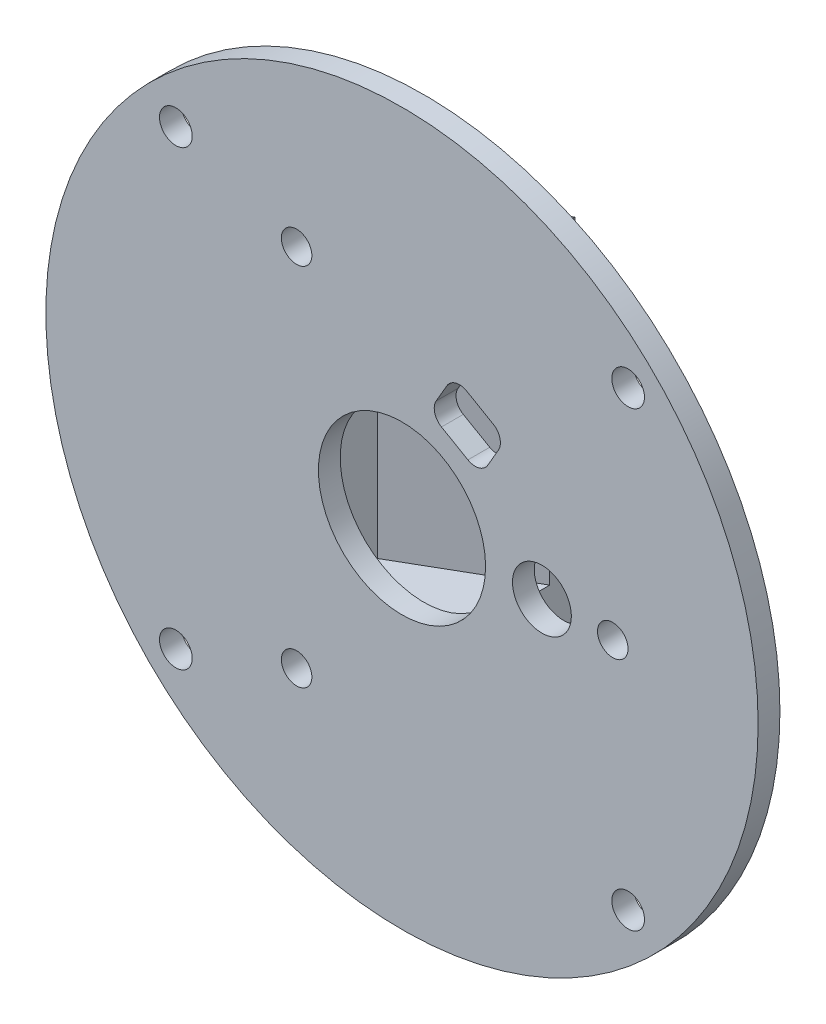
ISO-10303-21;
HEADER;
FILE_DESCRIPTION(('STEP AP214'),'2;1');
FILE_NAME('part.step','',(''),(''),'','','');
FILE_SCHEMA(('AUTOMOTIVE_DESIGN { 1 0 10303 214 1 1 1 1 }'));
ENDSEC;
DATA;
#1=APPLICATION_CONTEXT('core data for automotive mechanical design processes');
#2=APPLICATION_PROTOCOL_DEFINITION('international standard','automotive_design',2000,#1);
#3=PRODUCT_CONTEXT('',#1,'mechanical');
#4=PRODUCT('Part','Part','',(#3));
#5=PRODUCT_RELATED_PRODUCT_CATEGORY('part','',(#4));
#6=PRODUCT_DEFINITION_FORMATION('','',#4);
#7=PRODUCT_DEFINITION_CONTEXT('part definition',#1,'design');
#8=PRODUCT_DEFINITION('design','',#6,#7);
#9=PRODUCT_DEFINITION_SHAPE('','',#8);
#10=(LENGTH_UNIT() NAMED_UNIT(*) SI_UNIT(.MILLI.,.METRE.));
#11=(NAMED_UNIT(*) PLANE_ANGLE_UNIT() SI_UNIT($,.RADIAN.));
#12=(NAMED_UNIT(*) SI_UNIT($,.STERADIAN.) SOLID_ANGLE_UNIT());
#13=UNCERTAINTY_MEASURE_WITH_UNIT(LENGTH_MEASURE(1.E-05),#10,'distance_accuracy_value','');
#14=(GEOMETRIC_REPRESENTATION_CONTEXT(3) GLOBAL_UNCERTAINTY_ASSIGNED_CONTEXT((#13)) GLOBAL_UNIT_ASSIGNED_CONTEXT((#10,
#11,#12)) REPRESENTATION_CONTEXT('',''));
#15=CARTESIAN_POINT('',(0.,0.,0.));
#16=DIRECTION('',(0.,0.,1.));
#17=DIRECTION('',(1.,0.,0.));
#18=AXIS2_PLACEMENT_3D('',#15,#16,#17);
#19=CARTESIAN_POINT('',(0.,44.,0.));
#20=DIRECTION('',(0.,0.,1.));
#21=DIRECTION('',(1.,0.,0.));
#22=AXIS2_PLACEMENT_3D('',#19,#20,#21);
#23=PLANE('',#22);
#24=CARTESIAN_POINT('',(0.,0.,0.));
#25=DIRECTION('',(0.,0.,1.));
#26=DIRECTION('',(1.,0.,0.));
#27=AXIS2_PLACEMENT_3D('',#24,#25,#26);
#28=CIRCLE('',#27,49.);
#29=CARTESIAN_POINT('',(49.,0.,0.));
#30=VERTEX_POINT('',#29);
#31=EDGE_CURVE('E294',#30,#30,#28,.T.);
#32=ORIENTED_EDGE('',*,*,#31,.F.);
#33=EDGE_LOOP('',(#32));
#34=FACE_BOUND('',#33,.T.);
#35=CARTESIAN_POINT('',(-14.5000000000001,25.1147367097487,0.));
#36=DIRECTION('',(0.,0.,1.));
#37=DIRECTION('',(1.,0.,0.));
#38=AXIS2_PLACEMENT_3D('',#35,#36,#37);
#39=CIRCLE('',#38,2.1);
#40=CARTESIAN_POINT('',(-12.4000000000001,25.1147367097487,0.));
#41=VERTEX_POINT('',#40);
#42=EDGE_CURVE('E280',#41,#41,#39,.T.);
#43=ORIENTED_EDGE('',*,*,#42,.T.);
#44=EDGE_LOOP('',(#43));
#45=FACE_BOUND('',#44,.T.);
#46=CARTESIAN_POINT('',(-14.5,-25.1147367097487,0.));
#47=DIRECTION('',(0.,0.,1.));
#48=DIRECTION('',(1.,0.,0.));
#49=AXIS2_PLACEMENT_3D('',#46,#47,#48);
#50=CIRCLE('',#49,2.1);
#51=CARTESIAN_POINT('',(-12.4,-25.1147367097487,0.));
#52=VERTEX_POINT('',#51);
#53=EDGE_CURVE('E277',#52,#52,#50,.T.);
#54=ORIENTED_EDGE('',*,*,#53,.T.);
#55=EDGE_LOOP('',(#54));
#56=FACE_BOUND('',#55,.T.);
#57=CARTESIAN_POINT('',(29.,0.,0.));
#58=DIRECTION('',(0.,0.,1.));
#59=DIRECTION('',(1.,0.,0.));
#60=AXIS2_PLACEMENT_3D('',#57,#58,#59);
#61=CIRCLE('',#60,2.1);
#62=CARTESIAN_POINT('',(31.1,0.,0.));
#63=VERTEX_POINT('',#62);
#64=EDGE_CURVE('E276',#63,#63,#61,.T.);
#65=ORIENTED_EDGE('',*,*,#64,.T.);
#66=EDGE_LOOP('',(#65));
#67=FACE_BOUND('',#66,.T.);
#68=CARTESIAN_POINT('',(19.25,0.,0.));
#69=DIRECTION('',(0.,0.,1.));
#70=DIRECTION('',(1.,0.,0.));
#71=AXIS2_PLACEMENT_3D('',#68,#69,#70);
#72=CIRCLE('',#71,4.05);
#73=CARTESIAN_POINT('',(23.3,0.,0.));
#74=VERTEX_POINT('',#73);
#75=EDGE_CURVE('E270',#74,#74,#72,.T.);
#76=ORIENTED_EDGE('',*,*,#75,.T.);
#77=EDGE_LOOP('',(#76));
#78=FACE_BOUND('',#77,.T.);
#79=DIRECTION('',(0.865954223402173,-0.500123267776995,0.));
#80=VECTOR('',#79,1.);
#81=CARTESIAN_POINT('',(7.1716578266679,20.6155722960598,0.));
#82=LINE('',#81,#80);
#83=CARTESIAN_POINT('',(8.90356627347225,19.6153257605058,0.));
#84=VERTEX_POINT('',#83);
#85=CARTESIAN_POINT('',(12.5405740117614,17.5148080358424,0.));
#86=VERTEX_POINT('',#85);
#87=EDGE_CURVE('E249',#84,#86,#82,.T.);
#88=ORIENTED_EDGE('',*,*,#87,.F.);
#89=CARTESIAN_POINT('',(7.90331973791826,17.8834173137014,0.));
#90=DIRECTION('',(0.,0.,1.));
#91=DIRECTION('',(1.,0.,0.));
#92=AXIS2_PLACEMENT_3D('',#89,#90,#91);
#93=CIRCLE('',#92,2.);
#94=CARTESIAN_POINT('',(6.17141129111391,18.8836638492554,0.));
#95=VERTEX_POINT('',#94);
#96=EDGE_CURVE('E320',#84,#95,#93,.T.);
#97=ORIENTED_EDGE('',*,*,#96,.T.);
#98=DIRECTION('',(0.500123267776996,0.865954223402172,0.));
#99=VECTOR('',#98,1.);
#100=CARTESIAN_POINT('',(3.70137506681753,14.6068416372172,0.));
#101=LINE('',#100,#99);
#102=CARTESIAN_POINT('',(4.70162160237152,16.3387500840215,0.));
#103=VERTEX_POINT('',#102);
#104=EDGE_CURVE('E246',#103,#95,#101,.T.);
#105=ORIENTED_EDGE('',*,*,#104,.F.);
#106=CARTESIAN_POINT('',(6.43353004917586,15.3385035484675,0.));
#107=DIRECTION('',(0.,0.,1.));
#108=DIRECTION('',(1.,0.,0.));
#109=AXIS2_PLACEMENT_3D('',#106,#107,#108);
#110=CIRCLE('',#109,2.);
#111=CARTESIAN_POINT('',(5.43328351362187,13.6065951016632,0.));
#112=VERTEX_POINT('',#111);
#113=EDGE_CURVE('E332',#103,#112,#110,.T.);
#114=ORIENTED_EDGE('',*,*,#113,.T.);
#115=DIRECTION('',(0.865954223402172,-0.500123267776995,0.));
#116=VECTOR('',#115,1.);
#117=CARTESIAN_POINT('',(3.70137506681753,14.6068416372172,0.));
#118=LINE('',#117,#116);
#119=CARTESIAN_POINT('',(9.070291251911,11.5060773769998,0.));
#120=VERTEX_POINT('',#119);
#121=EDGE_CURVE('E255',#112,#120,#118,.T.);
#122=ORIENTED_EDGE('',*,*,#121,.T.);
#123=CARTESIAN_POINT('',(10.070537787465,13.2379858238042,0.));
#124=DIRECTION('',(0.,0.,1.));
#125=DIRECTION('',(1.,0.,0.));
#126=AXIS2_PLACEMENT_3D('',#123,#124,#125);
#127=CIRCLE('',#126,2.);
#128=CARTESIAN_POINT('',(11.8024462342693,12.2377392882502,0.));
#129=VERTEX_POINT('',#128);
#130=EDGE_CURVE('E328',#120,#129,#127,.T.);
#131=ORIENTED_EDGE('',*,*,#130,.T.);
#132=DIRECTION('',(0.500123267776995,0.865954223402173,0.));
#133=VECTOR('',#132,1.);
#134=CARTESIAN_POINT('',(10.8021996987153,10.5058308414458,0.));
#135=LINE('',#134,#133);
#136=CARTESIAN_POINT('',(13.2722359230117,14.7826530534841,0.));
#137=VERTEX_POINT('',#136);
#138=EDGE_CURVE('E252',#129,#137,#135,.T.);
#139=ORIENTED_EDGE('',*,*,#138,.T.);
#140=CARTESIAN_POINT('',(11.5403274762074,15.7828995890381,0.));
#141=DIRECTION('',(0.,0.,1.));
#142=DIRECTION('',(1.,0.,0.));
#143=AXIS2_PLACEMENT_3D('',#140,#141,#142);
#144=CIRCLE('',#143,2.);
#145=EDGE_CURVE('E324',#137,#86,#144,.T.);
#146=ORIENTED_EDGE('',*,*,#145,.T.);
#147=EDGE_LOOP('',(#88,#97,#105,#114,#122,#131,#139,#146));
#148=FACE_BOUND('',#147,.T.);
#149=CARTESIAN_POINT('',(0.,0.,0.));
#150=DIRECTION('',(0.,0.,1.));
#151=DIRECTION('',(1.,0.,0.));
#152=AXIS2_PLACEMENT_3D('',#149,#150,#151);
#153=CIRCLE('',#152,11.5);
#154=CARTESIAN_POINT('',(11.5,0.,0.));
#155=VERTEX_POINT('',#154);
#156=EDGE_CURVE('E240',#155,#155,#153,.T.);
#157=ORIENTED_EDGE('',*,*,#156,.T.);
#158=EDGE_LOOP('',(#157));
#159=FACE_BOUND('',#158,.T.);
#160=CARTESIAN_POINT('',(-31.1126983722072,31.1126983722073,0.));
#161=DIRECTION('',(0.,0.,1.));
#162=DIRECTION('',(1.,0.,0.));
#163=AXIS2_PLACEMENT_3D('',#160,#161,#162);
#164=CIRCLE('',#163,2.25);
#165=CARTESIAN_POINT('',(-28.8626983722072,31.1126983722073,0.));
#166=VERTEX_POINT('',#165);
#167=EDGE_CURVE('E237',#166,#166,#164,.F.);
#168=ORIENTED_EDGE('',*,*,#167,.F.);
#169=EDGE_LOOP('',(#168));
#170=FACE_BOUND('',#169,.T.);
#171=CARTESIAN_POINT('',(31.1126983722071,31.1126983722073,0.));
#172=DIRECTION('',(0.,0.,1.));
#173=DIRECTION('',(1.,0.,0.));
#174=AXIS2_PLACEMENT_3D('',#171,#172,#173);
#175=CIRCLE('',#174,2.25);
#176=CARTESIAN_POINT('',(33.3626983722071,31.1126983722073,0.));
#177=VERTEX_POINT('',#176);
#178=EDGE_CURVE('E220',#177,#177,#175,.F.);
#179=ORIENTED_EDGE('',*,*,#178,.F.);
#180=EDGE_LOOP('',(#179));
#181=FACE_BOUND('',#180,.T.);
#182=CARTESIAN_POINT('',(31.1126983722072,-31.1126983722073,0.));
#183=DIRECTION('',(0.,0.,1.));
#184=DIRECTION('',(1.,0.,0.));
#185=AXIS2_PLACEMENT_3D('',#182,#183,#184);
#186=CIRCLE('',#185,2.25000000000001);
#187=CARTESIAN_POINT('',(33.3626983722072,-31.1126983722073,0.));
#188=VERTEX_POINT('',#187);
#189=EDGE_CURVE('E221',#188,#188,#186,.F.);
#190=ORIENTED_EDGE('',*,*,#189,.F.);
#191=EDGE_LOOP('',(#190));
#192=FACE_BOUND('',#191,.T.);
#193=CARTESIAN_POINT('',(-31.1126983722071,-31.1126983722073,0.));
#194=DIRECTION('',(0.,0.,1.));
#195=DIRECTION('',(1.,0.,0.));
#196=AXIS2_PLACEMENT_3D('',#193,#194,#195);
#197=CIRCLE('',#196,2.25);
#198=CARTESIAN_POINT('',(-28.8626983722072,-31.1126983722073,0.));
#199=VERTEX_POINT('',#198);
#200=EDGE_CURVE('E228',#199,#199,#197,.F.);
#201=ORIENTED_EDGE('',*,*,#200,.F.);
#202=EDGE_LOOP('',(#201));
#203=FACE_BOUND('',#202,.T.);
#204=DIRECTION('',(-1.,0.,0.));
#205=VECTOR('',#204,1.);
#206=CARTESIAN_POINT('',(0.,-22.1147367097487,0.));
#207=LINE('',#206,#205);
#208=CARTESIAN_POINT('',(0.,-22.1147367097487,0.));
#209=VERTEX_POINT('',#208);
#210=CARTESIAN_POINT('',(-26.,-22.1147367097487,0.));
#211=VERTEX_POINT('',#210);
#212=EDGE_CURVE('E409',#209,#211,#207,.T.);
#213=ORIENTED_EDGE('',*,*,#212,.F.);
#214=DIRECTION('',(0.,1.,0.));
#215=VECTOR('',#214,1.);
#216=CARTESIAN_POINT('',(0.,0.,0.));
#217=LINE('',#216,#215);
#218=CARTESIAN_POINT('',(0.,-18.1147367097487,0.));
#219=VERTEX_POINT('',#218);
#220=EDGE_CURVE('E398',#209,#219,#217,.T.);
#221=ORIENTED_EDGE('',*,*,#220,.T.);
#222=DIRECTION('',(-1.,0.,0.));
#223=VECTOR('',#222,1.);
#224=CARTESIAN_POINT('',(0.,-18.1147367097487,0.));
#225=LINE('',#224,#223);
#226=CARTESIAN_POINT('',(-15.,-18.1147367097487,0.));
#227=VERTEX_POINT('',#226);
#228=EDGE_CURVE('E400',#219,#227,#225,.T.);
#229=ORIENTED_EDGE('',*,*,#228,.T.);
#230=DIRECTION('',(0.,-1.,0.));
#231=VECTOR('',#230,1.);
#232=CARTESIAN_POINT('',(-15.,0.,0.));
#233=LINE('',#232,#231);
#234=CARTESIAN_POINT('',(-15.,18.1147367097487,0.));
#235=VERTEX_POINT('',#234);
#236=EDGE_CURVE('E402',#235,#227,#233,.T.);
#237=ORIENTED_EDGE('',*,*,#236,.F.);
#238=DIRECTION('',(-1.,0.,0.));
#239=VECTOR('',#238,1.);
#240=CARTESIAN_POINT('',(0.,18.1147367097487,0.));
#241=LINE('',#240,#239);
#242=CARTESIAN_POINT('',(0.,18.1147367097487,0.));
#243=VERTEX_POINT('',#242);
#244=EDGE_CURVE('E59',#243,#235,#241,.T.);
#245=ORIENTED_EDGE('',*,*,#244,.F.);
#246=DIRECTION('',(0.,-1.,0.));
#247=VECTOR('',#246,1.);
#248=CARTESIAN_POINT('',(0.,0.,0.));
#249=LINE('',#248,#247);
#250=CARTESIAN_POINT('',(0.,22.1147367097486,0.));
#251=VERTEX_POINT('',#250);
#252=EDGE_CURVE('E54',#251,#243,#249,.T.);
#253=ORIENTED_EDGE('',*,*,#252,.F.);
#254=DIRECTION('',(-1.,0.,0.));
#255=VECTOR('',#254,1.);
#256=CARTESIAN_POINT('',(0.,22.1147367097486,0.));
#257=LINE('',#256,#255);
#258=CARTESIAN_POINT('',(-26.,22.1147367097486,0.));
#259=VERTEX_POINT('',#258);
#260=EDGE_CURVE('E407',#251,#259,#257,.T.);
#261=ORIENTED_EDGE('',*,*,#260,.T.);
#262=DIRECTION('',(0.,1.,0.));
#263=VECTOR('',#262,1.);
#264=CARTESIAN_POINT('',(-26.,0.,0.));
#265=LINE('',#264,#263);
#266=CARTESIAN_POINT('',(-26.,24.,0.));
#267=VERTEX_POINT('',#266);
#268=EDGE_CURVE('E207',#259,#267,#265,.T.);
#269=ORIENTED_EDGE('',*,*,#268,.T.);
#270=DIRECTION('',(1.,0.,0.));
#271=VECTOR('',#270,1.);
#272=CARTESIAN_POINT('',(0.,24.,0.));
#273=LINE('',#272,#271);
#274=CARTESIAN_POINT('',(-36.,24.,0.));
#275=VERTEX_POINT('',#274);
#276=EDGE_CURVE('E198',#275,#267,#273,.T.);
#277=ORIENTED_EDGE('',*,*,#276,.F.);
#278=DIRECTION('',(0.,1.,0.));
#279=VECTOR('',#278,1.);
#280=CARTESIAN_POINT('',(-36.,0.,0.));
#281=LINE('',#280,#279);
#282=CARTESIAN_POINT('',(-36.,-24.,0.));
#283=VERTEX_POINT('',#282);
#284=EDGE_CURVE('E183',#283,#275,#281,.T.);
#285=ORIENTED_EDGE('',*,*,#284,.F.);
#286=DIRECTION('',(1.,0.,0.));
#287=VECTOR('',#286,1.);
#288=CARTESIAN_POINT('',(0.,-24.,0.));
#289=LINE('',#288,#287);
#290=CARTESIAN_POINT('',(-26.,-24.,0.));
#291=VERTEX_POINT('',#290);
#292=EDGE_CURVE('E195',#283,#291,#289,.T.);
#293=ORIENTED_EDGE('',*,*,#292,.T.);
#294=EDGE_CURVE('E205',#291,#211,#265,.T.);
#295=ORIENTED_EDGE('',*,*,#294,.T.);
#296=EDGE_LOOP('',(#213,#221,#229,#237,#245,#253,#261,#269,#277,#285,#293,#295));
#297=FACE_BOUND('',#296,.T.);
#298=ADVANCED_FACE('F39',(#34,#45,#56,#67,#78,#148,#159,#170,#181,#192,#203,#297),#23,.F.);
#299=CARTESIAN_POINT('',(-26.,0.,-10.));
#300=DIRECTION('',(1.,0.,0.));
#301=DIRECTION('',(0.,1.,0.));
#302=AXIS2_PLACEMENT_3D('',#299,#300,#301);
#303=PLANE('',#302);
#304=DIRECTION('',(0.,-1.,0.));
#305=VECTOR('',#304,1.);
#306=CARTESIAN_POINT('',(-26.,0.,-2.30940107675844));
#307=LINE('',#306,#305);
#308=CARTESIAN_POINT('',(-26.,-22.1147367097487,-2.30940107675843));
#309=VERTEX_POINT('',#308);
#310=CARTESIAN_POINT('',(-26.,-24.,-2.30940107675843));
#311=VERTEX_POINT('',#310);
#312=EDGE_CURVE('E372',#309,#311,#307,.T.);
#313=ORIENTED_EDGE('',*,*,#312,.F.);
#314=DIRECTION('',(0.,0.,1.));
#315=VECTOR('',#314,1.);
#316=CARTESIAN_POINT('',(-26.,-22.1147367097487,-18.));
#317=LINE('',#316,#315);
#318=EDGE_CURVE('E378',#309,#211,#317,.T.);
#319=ORIENTED_EDGE('',*,*,#318,.T.);
#320=ORIENTED_EDGE('',*,*,#294,.F.);
#321=DIRECTION('',(0.,0.,1.));
#322=VECTOR('',#321,1.);
#323=CARTESIAN_POINT('',(-26.,-24.,-10.));
#324=LINE('',#323,#322);
#325=EDGE_CURVE('E203',#311,#291,#324,.T.);
#326=ORIENTED_EDGE('',*,*,#325,.F.);
#327=EDGE_LOOP('',(#313,#319,#320,#326));
#328=FACE_BOUND('',#327,.T.);
#329=ADVANCED_FACE('F418',(#328),#303,.T.);
#330=CARTESIAN_POINT('',(-8.99999999999981,-24.,-15.5884572681198));
#331=DIRECTION('',(0.499999999999995,0.,0.866025403784441));
#332=DIRECTION('',(0.866025403784442,0.,-0.499999999999995));
#333=AXIS2_PLACEMENT_3D('',#330,#331,#332);
#334=PLANE('',#333);
#335=DIRECTION('',(0.866025403784442,0.,-0.499999999999995));
#336=VECTOR('',#335,1.);
#337=CARTESIAN_POINT('',(-8.99999999999981,-24.,-15.5884572681198));
#338=LINE('',#337,#336);
#339=CARTESIAN_POINT('',(0.,-24.,-20.7846096908262));
#340=VERTEX_POINT('',#339);
#341=EDGE_CURVE('E180',#283,#340,#338,.T.);
#342=ORIENTED_EDGE('',*,*,#341,.F.);
#343=ORIENTED_EDGE('',*,*,#284,.T.);
#344=DIRECTION('',(0.866025403784442,0.,-0.499999999999995));
#345=VECTOR('',#344,1.);
#346=CARTESIAN_POINT('',(-8.99999999999981,24.,-15.5884572681198));
#347=LINE('',#346,#345);
#348=CARTESIAN_POINT('',(0.,24.,-20.7846096908262));
#349=VERTEX_POINT('',#348);
#350=EDGE_CURVE('E377',#275,#349,#347,.T.);
#351=ORIENTED_EDGE('',*,*,#350,.T.);
#352=DIRECTION('',(0.,1.,0.));
#353=VECTOR('',#352,1.);
#354=CARTESIAN_POINT('',(0.,-24.,-20.7846096908262));
#355=LINE('',#354,#353);
#356=EDGE_CURVE('E186',#340,#349,#355,.T.);
#357=ORIENTED_EDGE('',*,*,#356,.F.);
#358=EDGE_LOOP('',(#342,#343,#351,#357));
#359=FACE_BOUND('',#358,.T.);
#360=ADVANCED_FACE('F182',(#359),#334,.F.);
#361=CARTESIAN_POINT('',(-7.49999999999983,-24.,-12.9903810567665));
#362=DIRECTION('',(0.499999999999995,0.,0.866025403784441));
#363=DIRECTION('',(0.866025403784442,0.,-0.499999999999995));
#364=AXIS2_PLACEMENT_3D('',#361,#362,#363);
#365=PLANE('',#364);
#366=DIRECTION('',(0.,1.,0.));
#367=VECTOR('',#366,1.);
#368=CARTESIAN_POINT('',(0.,-24.,-17.3205080756885));
#369=LINE('',#368,#367);
#370=CARTESIAN_POINT('',(0.,-24.,-17.3205080756885));
#371=VERTEX_POINT('',#370);
#372=CARTESIAN_POINT('',(0.,-22.1147367097487,-17.3205080756885));
#373=VERTEX_POINT('',#372);
#374=EDGE_CURVE('E366',#371,#373,#369,.T.);
#375=ORIENTED_EDGE('',*,*,#374,.T.);
#376=DIRECTION('',(-0.866025403784442,0.,0.499999999999995));
#377=VECTOR('',#376,1.);
#378=CARTESIAN_POINT('',(-7.49999999999983,-22.1147367097487,-12.9903810567665));
#379=LINE('',#378,#377);
#380=EDGE_CURVE('E11',#373,#309,#379,.T.);
#381=ORIENTED_EDGE('',*,*,#380,.T.);
#382=ORIENTED_EDGE('',*,*,#312,.T.);
#383=DIRECTION('',(0.866025403784442,0.,-0.499999999999995));
#384=VECTOR('',#383,1.);
#385=CARTESIAN_POINT('',(-7.49999999999983,-24.,-12.9903810567665));
#386=LINE('',#385,#384);
#387=EDGE_CURVE('E191',#311,#371,#386,.T.);
#388=ORIENTED_EDGE('',*,*,#387,.T.);
#389=EDGE_LOOP('',(#375,#381,#382,#388));
#390=FACE_BOUND('',#389,.T.);
#391=ADVANCED_FACE('F419',(#390),#365,.T.);
#392=CARTESIAN_POINT('',(0.,-18.1147367097487,-17.3205080756885));
#393=VERTEX_POINT('',#392);
#394=CARTESIAN_POINT('',(0.,18.1147367097487,-17.3205080756885));
#395=VERTEX_POINT('',#394);
#396=EDGE_CURVE('E363',#393,#395,#369,.T.);
#397=ORIENTED_EDGE('',*,*,#396,.T.);
#398=DIRECTION('',(-0.866025403784442,0.,0.499999999999995));
#399=VECTOR('',#398,1.);
#400=CARTESIAN_POINT('',(-7.49999999999983,18.1147367097487,-12.9903810567665));
#401=LINE('',#400,#399);
#402=CARTESIAN_POINT('',(-15.,18.1147367097487,-8.66025403784423));
#403=VERTEX_POINT('',#402);
#404=EDGE_CURVE('E341',#395,#403,#401,.T.);
#405=ORIENTED_EDGE('',*,*,#404,.T.);
#406=DIRECTION('',(0.,-1.,0.));
#407=VECTOR('',#406,1.);
#408=CARTESIAN_POINT('',(-15.,-24.,-8.66025403784423));
#409=LINE('',#408,#407);
#410=CARTESIAN_POINT('',(-15.,-18.1147367097487,-8.66025403784423));
#411=VERTEX_POINT('',#410);
#412=EDGE_CURVE('E339',#403,#411,#409,.T.);
#413=ORIENTED_EDGE('',*,*,#412,.T.);
#414=DIRECTION('',(-0.866025403784442,0.,0.499999999999995));
#415=VECTOR('',#414,1.);
#416=CARTESIAN_POINT('',(-7.49999999999983,-18.1147367097487,-12.9903810567665));
#417=LINE('',#416,#415);
#418=EDGE_CURVE('E336',#393,#411,#417,.T.);
#419=ORIENTED_EDGE('',*,*,#418,.F.);
#420=EDGE_LOOP('',(#397,#405,#413,#419));
#421=FACE_BOUND('',#420,.T.);
#422=ADVANCED_FACE('F435',(#421),#365,.T.);
#423=CARTESIAN_POINT('',(0.,0.,3.));
#424=DIRECTION('',(0.,0.,-1.));
#425=DIRECTION('',(-1.,0.,0.));
#426=AXIS2_PLACEMENT_3D('',#423,#424,#425);
#427=CYLINDRICAL_SURFACE('',#426,49.);
#428=CARTESIAN_POINT('',(0.,0.,3.));
#429=DIRECTION('',(0.,0.,1.));
#430=DIRECTION('',(1.,0.,0.));
#431=AXIS2_PLACEMENT_3D('',#428,#429,#430);
#432=CIRCLE('',#431,49.);
#433=CARTESIAN_POINT('',(49.,0.,3.));
#434=VERTEX_POINT('',#433);
#435=EDGE_CURVE('E295',#434,#434,#432,.T.);
#436=ORIENTED_EDGE('',*,*,#435,.F.);
#437=EDGE_LOOP('',(#436));
#438=FACE_BOUND('',#437,.T.);
#439=ORIENTED_EDGE('',*,*,#31,.T.);
#440=EDGE_LOOP('',(#439));
#441=FACE_BOUND('',#440,.T.);
#442=ADVANCED_FACE('F437',(#438,#441),#427,.T.);
#443=CARTESIAN_POINT('',(0.,0.,3.));
#444=DIRECTION('',(0.,0.,1.));
#445=DIRECTION('',(1.,0.,0.));
#446=AXIS2_PLACEMENT_3D('',#443,#444,#445);
#447=PLANE('',#446);
#448=CARTESIAN_POINT('',(-31.1126983722071,-31.1126983722073,3.));
#449=DIRECTION('',(0.,0.,1.));
#450=DIRECTION('',(1.,0.,0.));
#451=AXIS2_PLACEMENT_3D('',#448,#449,#450);
#452=CIRCLE('',#451,2.25);
#453=CARTESIAN_POINT('',(-28.8626983722072,-31.1126983722073,3.));
#454=VERTEX_POINT('',#453);
#455=EDGE_CURVE('E216',#454,#454,#452,.T.);
#456=ORIENTED_EDGE('',*,*,#455,.F.);
#457=EDGE_LOOP('',(#456));
#458=FACE_BOUND('',#457,.T.);
#459=CARTESIAN_POINT('',(31.1126983722072,-31.1126983722073,3.));
#460=DIRECTION('',(0.,0.,1.));
#461=DIRECTION('',(1.,0.,0.));
#462=AXIS2_PLACEMENT_3D('',#459,#460,#461);
#463=CIRCLE('',#462,2.25000000000001);
#464=CARTESIAN_POINT('',(33.3626983722072,-31.1126983722073,3.));
#465=VERTEX_POINT('',#464);
#466=EDGE_CURVE('E225',#465,#465,#463,.T.);
#467=ORIENTED_EDGE('',*,*,#466,.F.);
#468=EDGE_LOOP('',(#467));
#469=FACE_BOUND('',#468,.T.);
#470=CARTESIAN_POINT('',(31.1126983722071,31.1126983722073,3.));
#471=DIRECTION('',(0.,0.,1.));
#472=DIRECTION('',(1.,0.,0.));
#473=AXIS2_PLACEMENT_3D('',#470,#471,#472);
#474=CIRCLE('',#473,2.25);
#475=CARTESIAN_POINT('',(33.3626983722071,31.1126983722073,3.));
#476=VERTEX_POINT('',#475);
#477=EDGE_CURVE('E217',#476,#476,#474,.T.);
#478=ORIENTED_EDGE('',*,*,#477,.F.);
#479=EDGE_LOOP('',(#478));
#480=FACE_BOUND('',#479,.T.);
#481=CARTESIAN_POINT('',(-31.1126983722072,31.1126983722073,3.));
#482=DIRECTION('',(0.,0.,1.));
#483=DIRECTION('',(1.,0.,0.));
#484=AXIS2_PLACEMENT_3D('',#481,#482,#483);
#485=CIRCLE('',#484,2.25);
#486=CARTESIAN_POINT('',(-28.8626983722072,31.1126983722073,3.));
#487=VERTEX_POINT('',#486);
#488=EDGE_CURVE('E224',#487,#487,#485,.T.);
#489=ORIENTED_EDGE('',*,*,#488,.F.);
#490=EDGE_LOOP('',(#489));
#491=FACE_BOUND('',#490,.T.);
#492=CARTESIAN_POINT('',(0.,0.,3.));
#493=DIRECTION('',(0.,0.,1.));
#494=DIRECTION('',(1.,0.,0.));
#495=AXIS2_PLACEMENT_3D('',#492,#493,#494);
#496=CIRCLE('',#495,11.5);
#497=CARTESIAN_POINT('',(11.5,0.,3.));
#498=VERTEX_POINT('',#497);
#499=EDGE_CURVE('E243',#498,#498,#496,.F.);
#500=ORIENTED_EDGE('',*,*,#499,.T.);
#501=EDGE_LOOP('',(#500));
#502=FACE_BOUND('',#501,.T.);
#503=DIRECTION('',(-0.500123267776996,-0.865954223402172,0.));
#504=VECTOR('',#503,1.);
#505=CARTESIAN_POINT('',(-3.55041231594891,2.05050539788568,3.));
#506=LINE('',#505,#504);
#507=CARTESIAN_POINT('',(6.17141129111391,18.8836638492554,3.));
#508=VERTEX_POINT('',#507);
#509=CARTESIAN_POINT('',(4.70162160237152,16.3387500840215,3.));
#510=VERTEX_POINT('',#509);
#511=EDGE_CURVE('E267',#508,#510,#506,.T.);
#512=ORIENTED_EDGE('',*,*,#511,.F.);
#513=CARTESIAN_POINT('',(7.90331973791826,17.8834173137014,3.));
#514=DIRECTION('',(0.,0.,1.));
#515=DIRECTION('',(1.,0.,0.));
#516=AXIS2_PLACEMENT_3D('',#513,#514,#515);
#517=CIRCLE('',#516,2.);
#518=CARTESIAN_POINT('',(8.90356627347225,19.6153257605058,3.));
#519=VERTEX_POINT('',#518);
#520=EDGE_CURVE('E322',#508,#519,#517,.F.);
#521=ORIENTED_EDGE('',*,*,#520,.T.);
#522=DIRECTION('',(-0.865954223402173,0.500123267776995,0.));
#523=VECTOR('',#522,1.);
#524=CARTESIAN_POINT('',(10.7220701426168,18.5650668981741,3.));
#525=LINE('',#524,#523);
#526=CARTESIAN_POINT('',(12.5405740117614,17.5148080358424,3.));
#527=VERTEX_POINT('',#526);
#528=EDGE_CURVE('E258',#527,#519,#525,.T.);
#529=ORIENTED_EDGE('',*,*,#528,.F.);
#530=CARTESIAN_POINT('',(11.5403274762074,15.7828995890381,3.));
#531=DIRECTION('',(0.,0.,1.));
#532=DIRECTION('',(1.,0.,0.));
#533=AXIS2_PLACEMENT_3D('',#530,#531,#532);
#534=CIRCLE('',#533,2.);
#535=CARTESIAN_POINT('',(13.2722359230117,14.7826530534841,3.));
#536=VERTEX_POINT('',#535);
#537=EDGE_CURVE('E326',#527,#536,#534,.F.);
#538=ORIENTED_EDGE('',*,*,#537,.T.);
#539=DIRECTION('',(-0.500123267776995,-0.865954223402173,0.));
#540=VECTOR('',#539,1.);
#541=CARTESIAN_POINT('',(3.55041231594891,-2.05050539788568,3.));
#542=LINE('',#541,#540);
#543=CARTESIAN_POINT('',(11.8024462342693,12.2377392882502,3.));
#544=VERTEX_POINT('',#543);
#545=EDGE_CURVE('E261',#536,#544,#542,.T.);
#546=ORIENTED_EDGE('',*,*,#545,.T.);
#547=CARTESIAN_POINT('',(10.070537787465,13.2379858238042,3.));
#548=DIRECTION('',(0.,0.,1.));
#549=DIRECTION('',(1.,0.,0.));
#550=AXIS2_PLACEMENT_3D('',#547,#548,#549);
#551=CIRCLE('',#550,2.);
#552=CARTESIAN_POINT('',(9.070291251911,11.5060773769998,3.));
#553=VERTEX_POINT('',#552);
#554=EDGE_CURVE('E330',#544,#553,#551,.F.);
#555=ORIENTED_EDGE('',*,*,#554,.T.);
#556=DIRECTION('',(-0.865954223402173,0.500123267776995,0.));
#557=VECTOR('',#556,1.);
#558=CARTESIAN_POINT('',(7.25178738276643,12.5563362393315,3.));
#559=LINE('',#558,#557);
#560=CARTESIAN_POINT('',(5.43328351362187,13.6065951016632,3.));
#561=VERTEX_POINT('',#560);
#562=EDGE_CURVE('E264',#553,#561,#559,.T.);
#563=ORIENTED_EDGE('',*,*,#562,.T.);
#564=CARTESIAN_POINT('',(6.43353004917586,15.3385035484675,3.));
#565=DIRECTION('',(0.,0.,1.));
#566=DIRECTION('',(1.,0.,0.));
#567=AXIS2_PLACEMENT_3D('',#564,#565,#566);
#568=CIRCLE('',#567,2.);
#569=EDGE_CURVE('E334',#561,#510,#568,.F.);
#570=ORIENTED_EDGE('',*,*,#569,.T.);
#571=EDGE_LOOP('',(#512,#521,#529,#538,#546,#555,#563,#570));
#572=FACE_BOUND('',#571,.T.);
#573=CARTESIAN_POINT('',(19.25,0.,3.));
#574=DIRECTION('',(0.,0.,1.));
#575=DIRECTION('',(1.,0.,0.));
#576=AXIS2_PLACEMENT_3D('',#573,#574,#575);
#577=CIRCLE('',#576,4.05);
#578=CARTESIAN_POINT('',(23.3,0.,3.));
#579=VERTEX_POINT('',#578);
#580=EDGE_CURVE('E273',#579,#579,#577,.F.);
#581=ORIENTED_EDGE('',*,*,#580,.T.);
#582=EDGE_LOOP('',(#581));
#583=FACE_BOUND('',#582,.T.);
#584=CARTESIAN_POINT('',(-14.5000000000001,25.1147367097487,3.));
#585=DIRECTION('',(0.,0.,1.));
#586=DIRECTION('',(1.,0.,0.));
#587=AXIS2_PLACEMENT_3D('',#584,#585,#586);
#588=CIRCLE('',#587,2.1);
#589=CARTESIAN_POINT('',(-12.4000000000001,25.1147367097487,3.));
#590=VERTEX_POINT('',#589);
#591=EDGE_CURVE('E285',#590,#590,#588,.F.);
#592=ORIENTED_EDGE('',*,*,#591,.T.);
#593=EDGE_LOOP('',(#592));
#594=FACE_BOUND('',#593,.T.);
#595=CARTESIAN_POINT('',(29.,0.,3.));
#596=DIRECTION('',(0.,0.,1.));
#597=DIRECTION('',(1.,0.,0.));
#598=AXIS2_PLACEMENT_3D('',#595,#596,#597);
#599=CIRCLE('',#598,2.1);
#600=CARTESIAN_POINT('',(31.1,0.,3.));
#601=VERTEX_POINT('',#600);
#602=EDGE_CURVE('E288',#601,#601,#599,.F.);
#603=ORIENTED_EDGE('',*,*,#602,.T.);
#604=EDGE_LOOP('',(#603));
#605=FACE_BOUND('',#604,.T.);
#606=CARTESIAN_POINT('',(-14.5,-25.1147367097487,3.));
#607=DIRECTION('',(0.,0.,1.));
#608=DIRECTION('',(1.,0.,0.));
#609=AXIS2_PLACEMENT_3D('',#606,#607,#608);
#610=CIRCLE('',#609,2.1);
#611=CARTESIAN_POINT('',(-12.4,-25.1147367097487,3.));
#612=VERTEX_POINT('',#611);
#613=EDGE_CURVE('E291',#612,#612,#610,.F.);
#614=ORIENTED_EDGE('',*,*,#613,.T.);
#615=EDGE_LOOP('',(#614));
#616=FACE_BOUND('',#615,.T.);
#617=ORIENTED_EDGE('',*,*,#435,.T.);
#618=EDGE_LOOP('',(#617));
#619=FACE_BOUND('',#618,.T.);
#620=ADVANCED_FACE('F444',(#458,#469,#480,#491,#502,#572,#583,#594,#605,#616,#619),#447,.T.);
#621=CARTESIAN_POINT('',(-14.5000000000001,25.1147367097487,13.));
#622=DIRECTION('',(0.,0.,-1.));
#623=DIRECTION('',(-1.,0.,0.));
#624=AXIS2_PLACEMENT_3D('',#621,#622,#623);
#625=CYLINDRICAL_SURFACE('',#624,2.1);
#626=ORIENTED_EDGE('',*,*,#591,.F.);
#627=EDGE_LOOP('',(#626));
#628=FACE_BOUND('',#627,.T.);
#629=ORIENTED_EDGE('',*,*,#42,.F.);
#630=EDGE_LOOP('',(#629));
#631=FACE_BOUND('',#630,.T.);
#632=ADVANCED_FACE('F559',(#628,#631),#625,.F.);
#633=CARTESIAN_POINT('',(-14.5,-25.1147367097487,13.));
#634=DIRECTION('',(0.,0.,-1.));
#635=DIRECTION('',(-1.,0.,0.));
#636=AXIS2_PLACEMENT_3D('',#633,#634,#635);
#637=CYLINDRICAL_SURFACE('',#636,2.1);
#638=ORIENTED_EDGE('',*,*,#613,.F.);
#639=EDGE_LOOP('',(#638));
#640=FACE_BOUND('',#639,.T.);
#641=ORIENTED_EDGE('',*,*,#53,.F.);
#642=EDGE_LOOP('',(#641));
#643=FACE_BOUND('',#642,.T.);
#644=ADVANCED_FACE('F556',(#640,#643),#637,.F.);
#645=CARTESIAN_POINT('',(29.,0.,13.));
#646=DIRECTION('',(0.,0.,-1.));
#647=DIRECTION('',(-1.,0.,0.));
#648=AXIS2_PLACEMENT_3D('',#645,#646,#647);
#649=CYLINDRICAL_SURFACE('',#648,2.1);
#650=ORIENTED_EDGE('',*,*,#602,.F.);
#651=EDGE_LOOP('',(#650));
#652=FACE_BOUND('',#651,.T.);
#653=ORIENTED_EDGE('',*,*,#64,.F.);
#654=EDGE_LOOP('',(#653));
#655=FACE_BOUND('',#654,.T.);
#656=ADVANCED_FACE('F554',(#652,#655),#649,.F.);
#657=CARTESIAN_POINT('',(19.25,0.,13.));
#658=DIRECTION('',(0.,0.,-1.));
#659=DIRECTION('',(-1.,0.,0.));
#660=AXIS2_PLACEMENT_3D('',#657,#658,#659);
#661=CYLINDRICAL_SURFACE('',#660,4.05);
#662=ORIENTED_EDGE('',*,*,#580,.F.);
#663=EDGE_LOOP('',(#662));
#664=FACE_BOUND('',#663,.T.);
#665=ORIENTED_EDGE('',*,*,#75,.F.);
#666=EDGE_LOOP('',(#665));
#667=FACE_BOUND('',#666,.T.);
#668=ADVANCED_FACE('F551',(#664,#667),#661,.F.);
#669=CARTESIAN_POINT('',(3.70137506681753,14.6068416372172,13.));
#670=DIRECTION('',(-0.865954223402173,0.500123267776996,0.));
#671=DIRECTION('',(-0.500123267776996,-0.865954223402172,0.));
#672=AXIS2_PLACEMENT_3D('',#669,#670,#671);
#673=PLANE('',#672);
#674=ORIENTED_EDGE('',*,*,#104,.T.);
#675=DIRECTION('',(0.,0.,-1.));
#676=VECTOR('',#675,1.);
#677=CARTESIAN_POINT('',(6.17141129111391,18.8836638492554,3.));
#678=LINE('',#677,#676);
#679=EDGE_CURVE('E308',#95,#508,#678,.F.);
#680=ORIENTED_EDGE('',*,*,#679,.T.);
#681=ORIENTED_EDGE('',*,*,#511,.T.);
#682=DIRECTION('',(0.,0.,-1.));
#683=VECTOR('',#682,1.);
#684=CARTESIAN_POINT('',(4.70162160237152,16.3387500840215,13.));
#685=LINE('',#684,#683);
#686=EDGE_CURVE('E305',#510,#103,#685,.T.);
#687=ORIENTED_EDGE('',*,*,#686,.T.);
#688=EDGE_LOOP('',(#674,#680,#681,#687));
#689=FACE_BOUND('',#688,.T.);
#690=ADVANCED_FACE('F496',(#689),#673,.F.);
#691=CARTESIAN_POINT('',(3.70137506681753,14.6068416372172,13.));
#692=DIRECTION('',(0.500123267776995,0.865954223402173,0.));
#693=DIRECTION('',(-0.865954223402173,0.500123267776995,0.));
#694=AXIS2_PLACEMENT_3D('',#691,#692,#693);
#695=PLANE('',#694);
#696=ORIENTED_EDGE('',*,*,#562,.F.);
#697=DIRECTION('',(0.,0.,-1.));
#698=VECTOR('',#697,1.);
#699=CARTESIAN_POINT('',(9.070291251911,11.5060773769998,0.));
#700=LINE('',#699,#698);
#701=EDGE_CURVE('E317',#553,#120,#700,.T.);
#702=ORIENTED_EDGE('',*,*,#701,.T.);
#703=ORIENTED_EDGE('',*,*,#121,.F.);
#704=DIRECTION('',(0.,0.,-1.));
#705=VECTOR('',#704,1.);
#706=CARTESIAN_POINT('',(5.43328351362187,13.6065951016632,13.));
#707=LINE('',#706,#705);
#708=EDGE_CURVE('E315',#112,#561,#707,.F.);
#709=ORIENTED_EDGE('',*,*,#708,.T.);
#710=EDGE_LOOP('',(#696,#702,#703,#709));
#711=FACE_BOUND('',#710,.T.);
#712=ADVANCED_FACE('F490',(#711),#695,.T.);
#713=CARTESIAN_POINT('',(10.8021996987153,10.5058308414458,13.));
#714=DIRECTION('',(-0.865954223402173,0.500123267776995,0.));
#715=DIRECTION('',(-0.500123267776995,-0.865954223402173,0.));
#716=AXIS2_PLACEMENT_3D('',#713,#714,#715);
#717=PLANE('',#716);
#718=ORIENTED_EDGE('',*,*,#545,.F.);
#719=DIRECTION('',(0.,0.,-1.));
#720=VECTOR('',#719,1.);
#721=CARTESIAN_POINT('',(13.2722359230117,14.7826530534841,13.));
#722=LINE('',#721,#720);
#723=EDGE_CURVE('E312',#536,#137,#722,.T.);
#724=ORIENTED_EDGE('',*,*,#723,.T.);
#725=ORIENTED_EDGE('',*,*,#138,.F.);
#726=DIRECTION('',(0.,0.,-1.));
#727=VECTOR('',#726,1.);
#728=CARTESIAN_POINT('',(11.8024462342693,12.2377392882502,3.));
#729=LINE('',#728,#727);
#730=EDGE_CURVE('E310',#129,#544,#729,.F.);
#731=ORIENTED_EDGE('',*,*,#730,.T.);
#732=EDGE_LOOP('',(#718,#724,#725,#731));
#733=FACE_BOUND('',#732,.T.);
#734=ADVANCED_FACE('F508',(#733),#717,.T.);
#735=CARTESIAN_POINT('',(7.1716578266679,20.6155722960598,13.));
#736=DIRECTION('',(0.500123267776995,0.865954223402173,0.));
#737=DIRECTION('',(-0.865954223402173,0.500123267776995,0.));
#738=AXIS2_PLACEMENT_3D('',#735,#736,#737);
#739=PLANE('',#738);
#740=ORIENTED_EDGE('',*,*,#528,.T.);
#741=DIRECTION('',(0.,0.,-1.));
#742=VECTOR('',#741,1.);
#743=CARTESIAN_POINT('',(8.90356627347225,19.6153257605058,0.));
#744=LINE('',#743,#742);
#745=EDGE_CURVE('E302',#519,#84,#744,.T.);
#746=ORIENTED_EDGE('',*,*,#745,.T.);
#747=ORIENTED_EDGE('',*,*,#87,.T.);
#748=DIRECTION('',(0.,0.,-1.));
#749=VECTOR('',#748,1.);
#750=CARTESIAN_POINT('',(12.5405740117614,17.5148080358424,13.));
#751=LINE('',#750,#749);
#752=EDGE_CURVE('E298',#86,#527,#751,.F.);
#753=ORIENTED_EDGE('',*,*,#752,.T.);
#754=EDGE_LOOP('',(#740,#746,#747,#753));
#755=FACE_BOUND('',#754,.T.);
#756=ADVANCED_FACE('F503',(#755),#739,.F.);
#757=CARTESIAN_POINT('',(0.,0.,13.));
#758=DIRECTION('',(0.,0.,-1.));
#759=DIRECTION('',(-1.,0.,0.));
#760=AXIS2_PLACEMENT_3D('',#757,#758,#759);
#761=CYLINDRICAL_SURFACE('',#760,11.5);
#762=ORIENTED_EDGE('',*,*,#499,.F.);
#763=EDGE_LOOP('',(#762));
#764=FACE_BOUND('',#763,.T.);
#765=ORIENTED_EDGE('',*,*,#156,.F.);
#766=EDGE_LOOP('',(#765));
#767=FACE_BOUND('',#766,.T.);
#768=ADVANCED_FACE('F468',(#764,#767),#761,.F.);
#769=CARTESIAN_POINT('',(7.90331973791826,17.8834173137014,13.));
#770=DIRECTION('',(0.,0.,1.));
#771=DIRECTION('',(1.,0.,0.));
#772=AXIS2_PLACEMENT_3D('',#769,#770,#771);
#773=CYLINDRICAL_SURFACE('',#772,2.);
#774=ORIENTED_EDGE('',*,*,#520,.F.);
#775=ORIENTED_EDGE('',*,*,#679,.F.);
#776=ORIENTED_EDGE('',*,*,#96,.F.);
#777=ORIENTED_EDGE('',*,*,#745,.F.);
#778=EDGE_LOOP('',(#774,#775,#776,#777));
#779=FACE_BOUND('',#778,.T.);
#780=ADVANCED_FACE('F464',(#779),#773,.F.);
#781=CARTESIAN_POINT('',(11.5403274762074,15.7828995890381,13.));
#782=DIRECTION('',(0.,0.,-1.));
#783=DIRECTION('',(-1.,0.,0.));
#784=AXIS2_PLACEMENT_3D('',#781,#782,#783);
#785=CYLINDRICAL_SURFACE('',#784,2.);
#786=ORIENTED_EDGE('',*,*,#537,.F.);
#787=ORIENTED_EDGE('',*,*,#752,.F.);
#788=ORIENTED_EDGE('',*,*,#145,.F.);
#789=ORIENTED_EDGE('',*,*,#723,.F.);
#790=EDGE_LOOP('',(#786,#787,#788,#789));
#791=FACE_BOUND('',#790,.T.);
#792=ADVANCED_FACE('F467',(#791),#785,.F.);
#793=CARTESIAN_POINT('',(10.070537787465,13.2379858238042,13.));
#794=DIRECTION('',(0.,0.,1.));
#795=DIRECTION('',(1.,0.,0.));
#796=AXIS2_PLACEMENT_3D('',#793,#794,#795);
#797=CYLINDRICAL_SURFACE('',#796,2.);
#798=ORIENTED_EDGE('',*,*,#554,.F.);
#799=ORIENTED_EDGE('',*,*,#730,.F.);
#800=ORIENTED_EDGE('',*,*,#130,.F.);
#801=ORIENTED_EDGE('',*,*,#701,.F.);
#802=EDGE_LOOP('',(#798,#799,#800,#801));
#803=FACE_BOUND('',#802,.T.);
#804=ADVANCED_FACE('F471',(#803),#797,.F.);
#805=CARTESIAN_POINT('',(6.43353004917586,15.3385035484675,13.));
#806=DIRECTION('',(0.,0.,-1.));
#807=DIRECTION('',(-1.,0.,0.));
#808=AXIS2_PLACEMENT_3D('',#805,#806,#807);
#809=CYLINDRICAL_SURFACE('',#808,2.);
#810=ORIENTED_EDGE('',*,*,#569,.F.);
#811=ORIENTED_EDGE('',*,*,#708,.F.);
#812=ORIENTED_EDGE('',*,*,#113,.F.);
#813=ORIENTED_EDGE('',*,*,#686,.F.);
#814=EDGE_LOOP('',(#810,#811,#812,#813));
#815=FACE_BOUND('',#814,.T.);
#816=ADVANCED_FACE('F41',(#815),#809,.F.);
#817=CARTESIAN_POINT('',(-31.1126983722072,31.1126983722073,-0.00100000000000013));
#818=DIRECTION('',(0.,0.,1.));
#819=DIRECTION('',(1.,0.,0.));
#820=AXIS2_PLACEMENT_3D('',#817,#818,#819);
#821=CYLINDRICAL_SURFACE('',#820,2.25);
#822=ORIENTED_EDGE('',*,*,#488,.T.);
#823=EDGE_LOOP('',(#822));
#824=FACE_BOUND('',#823,.T.);
#825=ORIENTED_EDGE('',*,*,#167,.T.);
#826=EDGE_LOOP('',(#825));
#827=FACE_BOUND('',#826,.T.);
#828=ADVANCED_FACE('F478',(#824,#827),#821,.F.);
#829=CARTESIAN_POINT('',(31.1126983722071,31.1126983722073,-0.00100000000000013));
#830=DIRECTION('',(0.,0.,1.));
#831=DIRECTION('',(1.,0.,0.));
#832=AXIS2_PLACEMENT_3D('',#829,#830,#831);
#833=CYLINDRICAL_SURFACE('',#832,2.25);
#834=ORIENTED_EDGE('',*,*,#477,.T.);
#835=EDGE_LOOP('',(#834));
#836=FACE_BOUND('',#835,.T.);
#837=ORIENTED_EDGE('',*,*,#178,.T.);
#838=EDGE_LOOP('',(#837));
#839=FACE_BOUND('',#838,.T.);
#840=ADVANCED_FACE('F532',(#836,#839),#833,.F.);
#841=CARTESIAN_POINT('',(31.1126983722072,-31.1126983722073,-0.00100000000000013));
#842=DIRECTION('',(0.,0.,1.));
#843=DIRECTION('',(1.,0.,0.));
#844=AXIS2_PLACEMENT_3D('',#841,#842,#843);
#845=CYLINDRICAL_SURFACE('',#844,2.25000000000001);
#846=ORIENTED_EDGE('',*,*,#466,.T.);
#847=EDGE_LOOP('',(#846));
#848=FACE_BOUND('',#847,.T.);
#849=ORIENTED_EDGE('',*,*,#189,.T.);
#850=EDGE_LOOP('',(#849));
#851=FACE_BOUND('',#850,.T.);
#852=ADVANCED_FACE('F524',(#848,#851),#845,.F.);
#853=CARTESIAN_POINT('',(-31.1126983722071,-31.1126983722073,-0.00100000000000013));
#854=DIRECTION('',(0.,0.,1.));
#855=DIRECTION('',(1.,0.,0.));
#856=AXIS2_PLACEMENT_3D('',#853,#854,#855);
#857=CYLINDRICAL_SURFACE('',#856,2.25);
#858=ORIENTED_EDGE('',*,*,#455,.T.);
#859=EDGE_LOOP('',(#858));
#860=FACE_BOUND('',#859,.T.);
#861=ORIENTED_EDGE('',*,*,#200,.T.);
#862=EDGE_LOOP('',(#861));
#863=FACE_BOUND('',#862,.T.);
#864=ADVANCED_FACE('F522',(#860,#863),#857,.F.);
#865=DIRECTION('',(0.,0.,1.));
#866=VECTOR('',#865,1.);
#867=CARTESIAN_POINT('',(-26.,22.1147367097486,-18.));
#868=LINE('',#867,#866);
#869=CARTESIAN_POINT('',(-26.,22.1147367097486,-2.30940107675844));
#870=VERTEX_POINT('',#869);
#871=EDGE_CURVE('E348',#870,#259,#868,.T.);
#872=ORIENTED_EDGE('',*,*,#871,.F.);
#873=CARTESIAN_POINT('',(-26.,24.,-2.30940107675844));
#874=VERTEX_POINT('',#873);
#875=EDGE_CURVE('E358',#874,#870,#307,.T.);
#876=ORIENTED_EDGE('',*,*,#875,.F.);
#877=DIRECTION('',(0.,0.,1.));
#878=VECTOR('',#877,1.);
#879=CARTESIAN_POINT('',(-26.,24.,-10.));
#880=LINE('',#879,#878);
#881=EDGE_CURVE('E212',#874,#267,#880,.T.);
#882=ORIENTED_EDGE('',*,*,#881,.T.);
#883=ORIENTED_EDGE('',*,*,#268,.F.);
#884=EDGE_LOOP('',(#872,#876,#882,#883));
#885=FACE_BOUND('',#884,.T.);
#886=ADVANCED_FACE('F459',(#885),#303,.T.);
#887=CARTESIAN_POINT('',(0.,-24.,-10.));
#888=DIRECTION('',(0.,-1.,0.));
#889=DIRECTION('',(0.,0.,-1.));
#890=AXIS2_PLACEMENT_3D('',#887,#888,#889);
#891=PLANE('',#890);
#892=ORIENTED_EDGE('',*,*,#292,.F.);
#893=ORIENTED_EDGE('',*,*,#341,.T.);
#894=DIRECTION('',(0.,0.,1.));
#895=VECTOR('',#894,1.);
#896=CARTESIAN_POINT('',(0.,-24.,0.));
#897=LINE('',#896,#895);
#898=EDGE_CURVE('E364',#340,#371,#897,.T.);
#899=ORIENTED_EDGE('',*,*,#898,.T.);
#900=ORIENTED_EDGE('',*,*,#387,.F.);
#901=ORIENTED_EDGE('',*,*,#325,.T.);
#902=EDGE_LOOP('',(#892,#893,#899,#900,#901));
#903=FACE_BOUND('',#902,.T.);
#904=ADVANCED_FACE('F200',(#903),#891,.T.);
#905=CARTESIAN_POINT('',(0.,24.,-10.));
#906=DIRECTION('',(0.,-1.,0.));
#907=DIRECTION('',(0.,0.,-1.));
#908=AXIS2_PLACEMENT_3D('',#905,#906,#907);
#909=PLANE('',#908);
#910=ORIENTED_EDGE('',*,*,#350,.F.);
#911=ORIENTED_EDGE('',*,*,#276,.T.);
#912=ORIENTED_EDGE('',*,*,#881,.F.);
#913=DIRECTION('',(0.866025403784442,0.,-0.499999999999995));
#914=VECTOR('',#913,1.);
#915=CARTESIAN_POINT('',(-7.49999999999983,24.,-12.9903810567665));
#916=LINE('',#915,#914);
#917=CARTESIAN_POINT('',(0.,24.,-17.3205080756885));
#918=VERTEX_POINT('',#917);
#919=EDGE_CURVE('E375',#874,#918,#916,.T.);
#920=ORIENTED_EDGE('',*,*,#919,.T.);
#921=DIRECTION('',(0.,0.,1.));
#922=VECTOR('',#921,1.);
#923=CARTESIAN_POINT('',(0.,24.,0.));
#924=LINE('',#923,#922);
#925=EDGE_CURVE('E192',#349,#918,#924,.T.);
#926=ORIENTED_EDGE('',*,*,#925,.F.);
#927=EDGE_LOOP('',(#910,#911,#912,#920,#926));
#928=FACE_BOUND('',#927,.T.);
#929=ADVANCED_FACE('F589',(#928),#909,.F.);
#930=CARTESIAN_POINT('',(0.,-24.,0.));
#931=DIRECTION('',(-1.,0.,0.));
#932=DIRECTION('',(0.,0.,1.));
#933=AXIS2_PLACEMENT_3D('',#930,#931,#932);
#934=PLANE('',#933);
#935=ORIENTED_EDGE('',*,*,#396,.F.);
#936=DIRECTION('',(0.,0.,1.));
#937=VECTOR('',#936,1.);
#938=CARTESIAN_POINT('',(0.,-18.1147367097487,-18.));
#939=LINE('',#938,#937);
#940=EDGE_CURVE('E392',#393,#219,#939,.T.);
#941=ORIENTED_EDGE('',*,*,#940,.T.);
#942=ORIENTED_EDGE('',*,*,#220,.F.);
#943=DIRECTION('',(0.,0.,1.));
#944=VECTOR('',#943,1.);
#945=CARTESIAN_POINT('',(0.,-22.1147367097487,-18.));
#946=LINE('',#945,#944);
#947=EDGE_CURVE('E395',#373,#209,#946,.T.);
#948=ORIENTED_EDGE('',*,*,#947,.F.);
#949=ORIENTED_EDGE('',*,*,#374,.F.);
#950=ORIENTED_EDGE('',*,*,#898,.F.);
#951=ORIENTED_EDGE('',*,*,#356,.T.);
#952=ORIENTED_EDGE('',*,*,#925,.T.);
#953=CARTESIAN_POINT('',(0.,22.1147367097486,-17.3205080756885));
#954=VERTEX_POINT('',#953);
#955=EDGE_CURVE('E355',#954,#918,#369,.T.);
#956=ORIENTED_EDGE('',*,*,#955,.F.);
#957=DIRECTION('',(0.,0.,1.));
#958=VECTOR('',#957,1.);
#959=CARTESIAN_POINT('',(0.,22.1147367097486,-18.));
#960=LINE('',#959,#958);
#961=EDGE_CURVE('E349',#954,#251,#960,.T.);
#962=ORIENTED_EDGE('',*,*,#961,.T.);
#963=ORIENTED_EDGE('',*,*,#252,.T.);
#964=DIRECTION('',(0.,0.,1.));
#965=VECTOR('',#964,1.);
#966=CARTESIAN_POINT('',(0.,18.1147367097487,-18.));
#967=LINE('',#966,#965);
#968=EDGE_CURVE('E384',#395,#243,#967,.T.);
#969=ORIENTED_EDGE('',*,*,#968,.F.);
#970=EDGE_LOOP('',(#935,#941,#942,#948,#949,#950,#951,#952,#956,#962,#963,#969));
#971=FACE_BOUND('',#970,.T.);
#972=ADVANCED_FACE('F361',(#971),#934,.F.);
#973=DIRECTION('',(-0.866025403784442,0.,0.499999999999995));
#974=VECTOR('',#973,1.);
#975=CARTESIAN_POINT('',(-7.49999999999983,22.1147367097486,-12.9903810567665));
#976=LINE('',#975,#974);
#977=EDGE_CURVE('E47',#954,#870,#976,.T.);
#978=ORIENTED_EDGE('',*,*,#977,.F.);
#979=ORIENTED_EDGE('',*,*,#955,.T.);
#980=ORIENTED_EDGE('',*,*,#919,.F.);
#981=ORIENTED_EDGE('',*,*,#875,.T.);
#982=EDGE_LOOP('',(#978,#979,#980,#981));
#983=FACE_BOUND('',#982,.T.);
#984=ADVANCED_FACE('F353',(#983),#365,.T.);
#985=CARTESIAN_POINT('',(0.,-18.1147367097487,-18.));
#986=DIRECTION('',(0.,1.,0.));
#987=DIRECTION('',(-1.,0.,0.));
#988=AXIS2_PLACEMENT_3D('',#985,#986,#987);
#989=PLANE('',#988);
#990=ORIENTED_EDGE('',*,*,#940,.F.);
#991=ORIENTED_EDGE('',*,*,#418,.T.);
#992=DIRECTION('',(0.,0.,1.));
#993=VECTOR('',#992,1.);
#994=CARTESIAN_POINT('',(-15.,-18.1147367097487,-18.));
#995=LINE('',#994,#993);
#996=EDGE_CURVE('E389',#411,#227,#995,.T.);
#997=ORIENTED_EDGE('',*,*,#996,.T.);
#998=ORIENTED_EDGE('',*,*,#228,.F.);
#999=EDGE_LOOP('',(#990,#991,#997,#998));
#1000=FACE_BOUND('',#999,.T.);
#1001=ADVANCED_FACE('F425',(#1000),#989,.T.);
#1002=CARTESIAN_POINT('',(-15.,0.,-18.));
#1003=DIRECTION('',(-1.,0.,0.));
#1004=DIRECTION('',(0.,-1.,0.));
#1005=AXIS2_PLACEMENT_3D('',#1002,#1003,#1004);
#1006=PLANE('',#1005);
#1007=ORIENTED_EDGE('',*,*,#412,.F.);
#1008=DIRECTION('',(0.,0.,1.));
#1009=VECTOR('',#1008,1.);
#1010=CARTESIAN_POINT('',(-15.,18.1147367097487,-18.));
#1011=LINE('',#1010,#1009);
#1012=EDGE_CURVE('E386',#403,#235,#1011,.T.);
#1013=ORIENTED_EDGE('',*,*,#1012,.T.);
#1014=ORIENTED_EDGE('',*,*,#236,.T.);
#1015=ORIENTED_EDGE('',*,*,#996,.F.);
#1016=EDGE_LOOP('',(#1007,#1013,#1014,#1015));
#1017=FACE_BOUND('',#1016,.T.);
#1018=ADVANCED_FACE('F430',(#1017),#1006,.F.);
#1019=CARTESIAN_POINT('',(0.,18.1147367097487,-18.));
#1020=DIRECTION('',(0.,1.,0.));
#1021=DIRECTION('',(0.,0.,1.));
#1022=AXIS2_PLACEMENT_3D('',#1019,#1020,#1021);
#1023=PLANE('',#1022);
#1024=ORIENTED_EDGE('',*,*,#404,.F.);
#1025=ORIENTED_EDGE('',*,*,#968,.T.);
#1026=ORIENTED_EDGE('',*,*,#244,.T.);
#1027=ORIENTED_EDGE('',*,*,#1012,.F.);
#1028=EDGE_LOOP('',(#1024,#1025,#1026,#1027));
#1029=FACE_BOUND('',#1028,.T.);
#1030=ADVANCED_FACE('F433',(#1029),#1023,.F.);
#1031=CARTESIAN_POINT('',(0.,22.1147367097486,-18.));
#1032=DIRECTION('',(0.,1.,0.));
#1033=DIRECTION('',(0.,0.,1.));
#1034=AXIS2_PLACEMENT_3D('',#1031,#1032,#1033);
#1035=PLANE('',#1034);
#1036=ORIENTED_EDGE('',*,*,#961,.F.);
#1037=ORIENTED_EDGE('',*,*,#977,.T.);
#1038=ORIENTED_EDGE('',*,*,#871,.T.);
#1039=ORIENTED_EDGE('',*,*,#260,.F.);
#1040=EDGE_LOOP('',(#1036,#1037,#1038,#1039));
#1041=FACE_BOUND('',#1040,.T.);
#1042=ADVANCED_FACE('F346',(#1041),#1035,.T.);
#1043=CARTESIAN_POINT('',(0.,-22.1147367097487,-18.));
#1044=DIRECTION('',(0.,1.,0.));
#1045=DIRECTION('',(-1.,0.,0.));
#1046=AXIS2_PLACEMENT_3D('',#1043,#1044,#1045);
#1047=PLANE('',#1046);
#1048=ORIENTED_EDGE('',*,*,#380,.F.);
#1049=ORIENTED_EDGE('',*,*,#947,.T.);
#1050=ORIENTED_EDGE('',*,*,#212,.T.);
#1051=ORIENTED_EDGE('',*,*,#318,.F.);
#1052=EDGE_LOOP('',(#1048,#1049,#1050,#1051));
#1053=FACE_BOUND('',#1052,.T.);
#1054=ADVANCED_FACE('F413',(#1053),#1047,.F.);
#1055=CLOSED_SHELL('',(#298,#329,#360,#391,#422,#442,#620,#632,#644,#656,#668,#690,#712,#734,
#756,#768,#780,#792,#804,#816,#828,#840,#852,#864,#886,#904,#929,#972,#984,#1001,#1018,#1030,
#1042,#1054));
#1056=MANIFOLD_SOLID_BREP('B2',#1055);
#1057=ADVANCED_BREP_SHAPE_REPRESENTATION('',(#18,#1056),#14);
#1058=SHAPE_DEFINITION_REPRESENTATION(#9,#1057);
ENDSEC;
END-ISO-10303-21;
